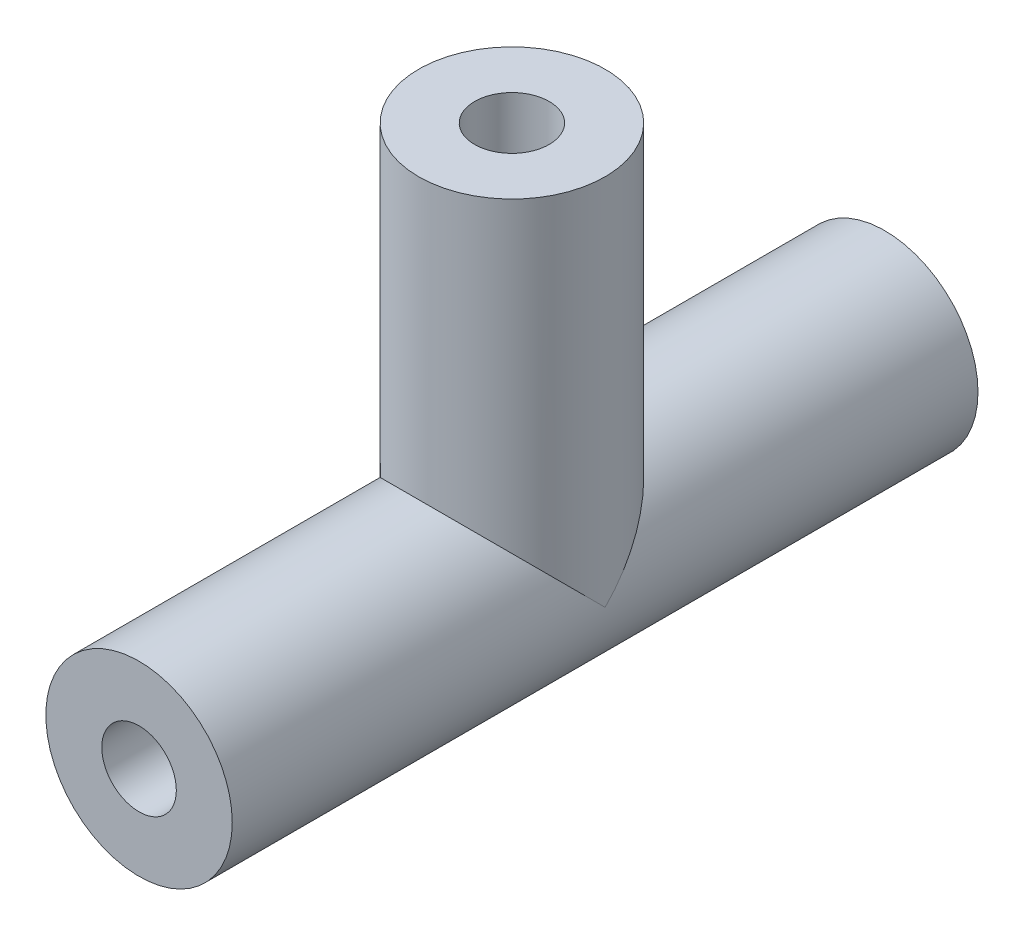
ISO-10303-21;
HEADER;
FILE_DESCRIPTION(('STEP AP214'),'2;1');
FILE_NAME('part.step','',(''),(''),'','','');
FILE_SCHEMA(('AUTOMOTIVE_DESIGN { 1 0 10303 214 1 1 1 1 }'));
ENDSEC;
DATA;
#1=APPLICATION_CONTEXT('core data for automotive mechanical design processes');
#2=APPLICATION_PROTOCOL_DEFINITION('international standard','automotive_design',2000,#1);
#3=PRODUCT_CONTEXT('',#1,'mechanical');
#4=PRODUCT('Part','Part','',(#3));
#5=PRODUCT_RELATED_PRODUCT_CATEGORY('part','',(#4));
#6=PRODUCT_DEFINITION_FORMATION('','',#4);
#7=PRODUCT_DEFINITION_CONTEXT('part definition',#1,'design');
#8=PRODUCT_DEFINITION('design','',#6,#7);
#9=PRODUCT_DEFINITION_SHAPE('','',#8);
#10=(LENGTH_UNIT() NAMED_UNIT(*) SI_UNIT(.MILLI.,.METRE.));
#11=(NAMED_UNIT(*) PLANE_ANGLE_UNIT() SI_UNIT($,.RADIAN.));
#12=(NAMED_UNIT(*) SI_UNIT($,.STERADIAN.) SOLID_ANGLE_UNIT());
#13=UNCERTAINTY_MEASURE_WITH_UNIT(LENGTH_MEASURE(1.E-05),#10,'distance_accuracy_value','');
#14=(GEOMETRIC_REPRESENTATION_CONTEXT(3) GLOBAL_UNCERTAINTY_ASSIGNED_CONTEXT((#13)) GLOBAL_UNIT_ASSIGNED_CONTEXT((#10,
#11,#12)) REPRESENTATION_CONTEXT('',''));
#15=CARTESIAN_POINT('',(0.,0.,0.));
#16=DIRECTION('',(0.,0.,1.));
#17=DIRECTION('',(1.,0.,0.));
#18=AXIS2_PLACEMENT_3D('',#15,#16,#17);
#19=CARTESIAN_POINT('',(0.,0.,-5.));
#20=DIRECTION('',(0.,0.,1.));
#21=DIRECTION('',(1.,0.,0.));
#22=AXIS2_PLACEMENT_3D('',#19,#20,#21);
#23=CYLINDRICAL_SURFACE('',#22,2.5);
#24=CARTESIAN_POINT('',(0.,0.,5.));
#25=DIRECTION('',(0.,0.707106781186547,0.707106781186547));
#26=DIRECTION('',(0.,0.707106781186547,-0.707106781186547));
#27=AXIS2_PLACEMENT_3D('',#24,#25,#26);
#28=ELLIPSE('',#27,3.53553390593274,2.5);
#29=CARTESIAN_POINT('',(-2.5,0.,5.));
#30=VERTEX_POINT('',#29);
#31=CARTESIAN_POINT('',(2.5,0.,5.));
#32=VERTEX_POINT('',#31);
#33=EDGE_CURVE('E85',#30,#32,#28,.F.);
#34=ORIENTED_EDGE('',*,*,#33,.T.);
#35=CARTESIAN_POINT('',(0.,0.,5.));
#36=DIRECTION('',(0.,0.707106781186547,-0.707106781186547));
#37=DIRECTION('',(0.,0.707106781186547,0.707106781186547));
#38=AXIS2_PLACEMENT_3D('',#35,#36,#37);
#39=ELLIPSE('',#38,3.53553390593274,2.5);
#40=EDGE_CURVE('E58',#32,#30,#39,.F.);
#41=ORIENTED_EDGE('',*,*,#40,.T.);
#42=EDGE_LOOP('',(#34,#41));
#43=FACE_BOUND('',#42,.T.);
#44=CARTESIAN_POINT('',(0.,0.,-5.));
#45=DIRECTION('',(0.,0.,1.));
#46=DIRECTION('',(1.,0.,0.));
#47=AXIS2_PLACEMENT_3D('',#44,#45,#46);
#48=CIRCLE('',#47,2.5);
#49=CARTESIAN_POINT('',(2.5,0.,-5.));
#50=VERTEX_POINT('',#49);
#51=EDGE_CURVE('E11',#50,#50,#48,.T.);
#52=ORIENTED_EDGE('',*,*,#51,.T.);
#53=EDGE_LOOP('',(#52));
#54=FACE_BOUND('',#53,.T.);
#55=CARTESIAN_POINT('',(0.,0.,15.));
#56=DIRECTION('',(0.,0.,1.));
#57=DIRECTION('',(1.,0.,0.));
#58=AXIS2_PLACEMENT_3D('',#55,#56,#57);
#59=CIRCLE('',#58,2.5);
#60=CARTESIAN_POINT('',(2.5,0.,15.));
#61=VERTEX_POINT('',#60);
#62=EDGE_CURVE('E45',#61,#61,#59,.T.);
#63=ORIENTED_EDGE('',*,*,#62,.F.);
#64=EDGE_LOOP('',(#63));
#65=FACE_BOUND('',#64,.T.);
#66=ADVANCED_FACE('F38',(#43,#54,#65),#23,.T.);
#67=CARTESIAN_POINT('',(0.,0.,-5.));
#68=DIRECTION('',(0.,0.,1.));
#69=DIRECTION('',(1.,0.,0.));
#70=AXIS2_PLACEMENT_3D('',#67,#68,#69);
#71=PLANE('',#70);
#72=CARTESIAN_POINT('',(0.,0.,-5.));
#73=DIRECTION('',(0.,0.,-1.));
#74=DIRECTION('',(-1.,0.,0.));
#75=AXIS2_PLACEMENT_3D('',#72,#73,#74);
#76=CIRCLE('',#75,1.);
#77=CARTESIAN_POINT('',(-1.,0.,-5.));
#78=VERTEX_POINT('',#77);
#79=EDGE_CURVE('E76',#78,#78,#76,.T.);
#80=ORIENTED_EDGE('',*,*,#79,.F.);
#81=EDGE_LOOP('',(#80));
#82=FACE_BOUND('',#81,.T.);
#83=ORIENTED_EDGE('',*,*,#51,.F.);
#84=EDGE_LOOP('',(#83));
#85=FACE_BOUND('',#84,.T.);
#86=ADVANCED_FACE('F92',(#82,#85),#71,.F.);
#87=CARTESIAN_POINT('',(0.,0.,15.));
#88=DIRECTION('',(0.,0.,1.));
#89=DIRECTION('',(1.,0.,0.));
#90=AXIS2_PLACEMENT_3D('',#87,#88,#89);
#91=PLANE('',#90);
#92=CARTESIAN_POINT('',(0.,0.,15.));
#93=DIRECTION('',(0.,0.,1.));
#94=DIRECTION('',(1.,0.,0.));
#95=AXIS2_PLACEMENT_3D('',#92,#93,#94);
#96=CIRCLE('',#95,1.);
#97=CARTESIAN_POINT('',(1.,0.,15.));
#98=VERTEX_POINT('',#97);
#99=EDGE_CURVE('E73',#98,#98,#96,.F.);
#100=ORIENTED_EDGE('',*,*,#99,.T.);
#101=EDGE_LOOP('',(#100));
#102=FACE_BOUND('',#101,.T.);
#103=ORIENTED_EDGE('',*,*,#62,.T.);
#104=EDGE_LOOP('',(#103));
#105=FACE_BOUND('',#104,.T.);
#106=ADVANCED_FACE('F89',(#102,#105),#91,.T.);
#107=CARTESIAN_POINT('',(0.,10.,5.));
#108=DIRECTION('',(0.,1.,0.));
#109=DIRECTION('',(0.,0.,1.));
#110=AXIS2_PLACEMENT_3D('',#107,#108,#109);
#111=PLANE('',#110);
#112=CARTESIAN_POINT('',(0.,10.,5.));
#113=DIRECTION('',(0.,1.,0.));
#114=DIRECTION('',(0.,0.,1.));
#115=AXIS2_PLACEMENT_3D('',#112,#113,#114);
#116=CIRCLE('',#115,1.);
#117=CARTESIAN_POINT('',(0.,10.,6.));
#118=VERTEX_POINT('',#117);
#119=EDGE_CURVE('E70',#118,#118,#116,.T.);
#120=ORIENTED_EDGE('',*,*,#119,.F.);
#121=EDGE_LOOP('',(#120));
#122=FACE_BOUND('',#121,.T.);
#123=CARTESIAN_POINT('',(0.,10.,5.));
#124=DIRECTION('',(0.,1.,0.));
#125=DIRECTION('',(0.,0.,1.));
#126=AXIS2_PLACEMENT_3D('',#123,#124,#125);
#127=CIRCLE('',#126,2.5);
#128=CARTESIAN_POINT('',(0.,10.,7.5));
#129=VERTEX_POINT('',#128);
#130=EDGE_CURVE('E79',#129,#129,#127,.T.);
#131=ORIENTED_EDGE('',*,*,#130,.T.);
#132=EDGE_LOOP('',(#131));
#133=FACE_BOUND('',#132,.T.);
#134=ADVANCED_FACE('F104',(#122,#133),#111,.T.);
#135=CARTESIAN_POINT('',(0.,-2.501,5.));
#136=DIRECTION('',(0.,1.,0.));
#137=DIRECTION('',(0.,0.,1.));
#138=AXIS2_PLACEMENT_3D('',#135,#136,#137);
#139=CYLINDRICAL_SURFACE('',#138,2.5);
#140=ORIENTED_EDGE('',*,*,#33,.F.);
#141=ORIENTED_EDGE('',*,*,#40,.F.);
#142=EDGE_LOOP('',(#140,#141));
#143=FACE_BOUND('',#142,.T.);
#144=ORIENTED_EDGE('',*,*,#130,.F.);
#145=EDGE_LOOP('',(#144));
#146=FACE_BOUND('',#145,.T.);
#147=ADVANCED_FACE('F101',(#143,#146),#139,.T.);
#148=CARTESIAN_POINT('',(0.,0.,15.001));
#149=DIRECTION('',(0.,0.,-1.));
#150=DIRECTION('',(-1.,0.,0.));
#151=AXIS2_PLACEMENT_3D('',#148,#149,#150);
#152=CYLINDRICAL_SURFACE('',#151,1.);
#153=CARTESIAN_POINT('',(0.,0.,5.));
#154=DIRECTION('',(0.,0.707106781186547,0.707106781186547));
#155=DIRECTION('',(0.,0.707106781186547,-0.707106781186547));
#156=AXIS2_PLACEMENT_3D('',#153,#154,#155);
#157=ELLIPSE('',#156,1.41421356237309,1.);
#158=CARTESIAN_POINT('',(-1.,0.,5.));
#159=VERTEX_POINT('',#158);
#160=CARTESIAN_POINT('',(1.,0.,5.));
#161=VERTEX_POINT('',#160);
#162=EDGE_CURVE('E63',#159,#161,#157,.F.);
#163=ORIENTED_EDGE('',*,*,#162,.F.);
#164=CARTESIAN_POINT('',(0.,0.,5.));
#165=DIRECTION('',(0.,0.707106781186547,-0.707106781186547));
#166=DIRECTION('',(0.,0.707106781186547,0.707106781186547));
#167=AXIS2_PLACEMENT_3D('',#164,#165,#166);
#168=ELLIPSE('',#167,1.41421356237309,1.);
#169=EDGE_CURVE('E51',#161,#159,#168,.F.);
#170=ORIENTED_EDGE('',*,*,#169,.F.);
#171=EDGE_LOOP('',(#163,#170));
#172=FACE_BOUND('',#171,.T.);
#173=ORIENTED_EDGE('',*,*,#99,.F.);
#174=EDGE_LOOP('',(#173));
#175=FACE_BOUND('',#174,.T.);
#176=ORIENTED_EDGE('',*,*,#79,.T.);
#177=EDGE_LOOP('',(#176));
#178=FACE_BOUND('',#177,.T.);
#179=ADVANCED_FACE('F68',(#172,#175,#178),#152,.F.);
#180=CARTESIAN_POINT('',(0.,-2.501,5.));
#181=DIRECTION('',(0.,1.,0.));
#182=DIRECTION('',(0.,0.,1.));
#183=AXIS2_PLACEMENT_3D('',#180,#181,#182);
#184=CYLINDRICAL_SURFACE('',#183,1.);
#185=ORIENTED_EDGE('',*,*,#169,.T.);
#186=ORIENTED_EDGE('',*,*,#162,.T.);
#187=EDGE_LOOP('',(#185,#186));
#188=FACE_BOUND('',#187,.T.);
#189=ORIENTED_EDGE('',*,*,#119,.T.);
#190=EDGE_LOOP('',(#189));
#191=FACE_BOUND('',#190,.T.);
#192=ADVANCED_FACE('F64',(#188,#191),#184,.F.);
#193=CLOSED_SHELL('',(#66,#86,#106,#134,#147,#179,#192));
#194=MANIFOLD_SOLID_BREP('B2',#193);
#195=ADVANCED_BREP_SHAPE_REPRESENTATION('',(#18,#194),#14);
#196=SHAPE_DEFINITION_REPRESENTATION(#9,#195);
ENDSEC;
END-ISO-10303-21;
